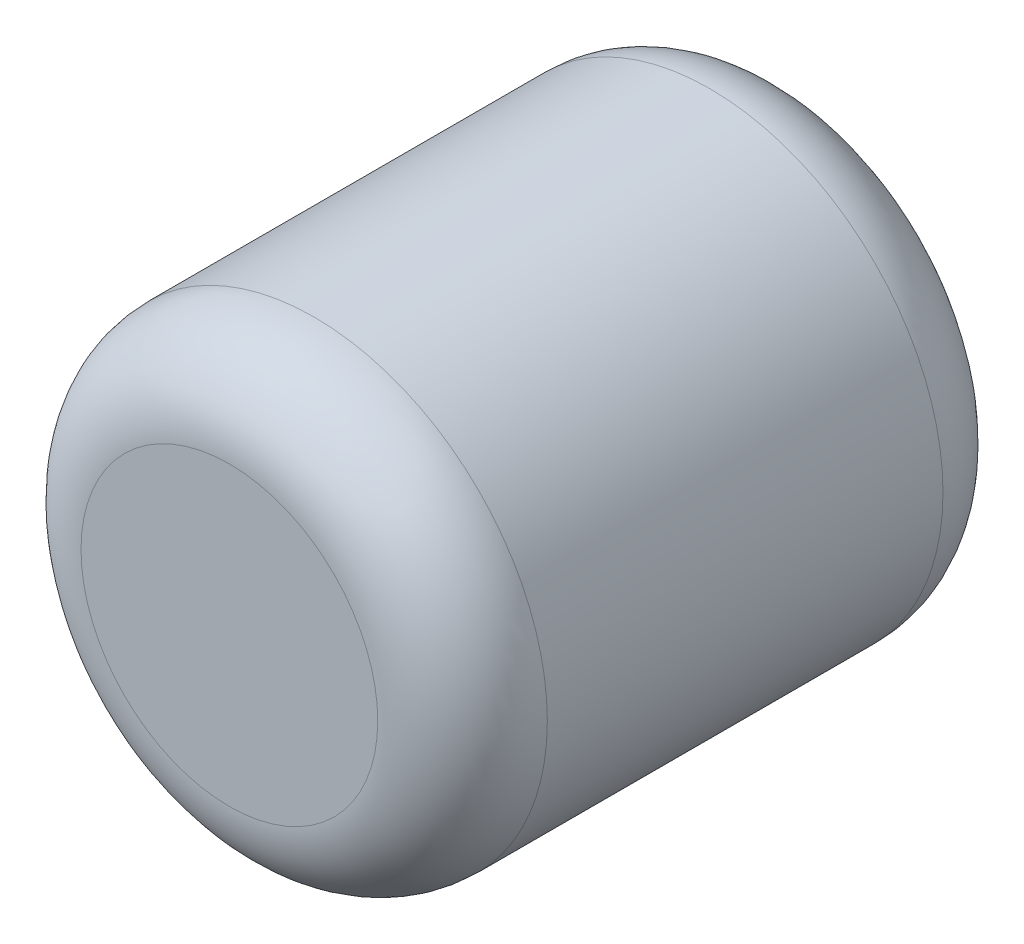
ISO-10303-21;
HEADER;
FILE_DESCRIPTION(('STEP AP214'),'2;1');
FILE_NAME('part.step','',(''),(''),'','','');
FILE_SCHEMA(('AUTOMOTIVE_DESIGN { 1 0 10303 214 1 1 1 1 }'));
ENDSEC;
DATA;
#1=APPLICATION_CONTEXT('core data for automotive mechanical design processes');
#2=APPLICATION_PROTOCOL_DEFINITION('international standard','automotive_design',2000,#1);
#3=PRODUCT_CONTEXT('',#1,'mechanical');
#4=PRODUCT('Part','Part','',(#3));
#5=PRODUCT_RELATED_PRODUCT_CATEGORY('part','',(#4));
#6=PRODUCT_DEFINITION_FORMATION('','',#4);
#7=PRODUCT_DEFINITION_CONTEXT('part definition',#1,'design');
#8=PRODUCT_DEFINITION('design','',#6,#7);
#9=PRODUCT_DEFINITION_SHAPE('','',#8);
#10=(LENGTH_UNIT() NAMED_UNIT(*) SI_UNIT(.MILLI.,.METRE.));
#11=(NAMED_UNIT(*) PLANE_ANGLE_UNIT() SI_UNIT($,.RADIAN.));
#12=(NAMED_UNIT(*) SI_UNIT($,.STERADIAN.) SOLID_ANGLE_UNIT());
#13=UNCERTAINTY_MEASURE_WITH_UNIT(LENGTH_MEASURE(1.E-05),#10,'distance_accuracy_value','');
#14=(GEOMETRIC_REPRESENTATION_CONTEXT(3) GLOBAL_UNCERTAINTY_ASSIGNED_CONTEXT((#13)) GLOBAL_UNIT_ASSIGNED_CONTEXT((#10,
#11,#12)) REPRESENTATION_CONTEXT('',''));
#15=CARTESIAN_POINT('',(0.,0.,0.));
#16=DIRECTION('',(0.,0.,1.));
#17=DIRECTION('',(1.,0.,0.));
#18=AXIS2_PLACEMENT_3D('',#15,#16,#17);
#19=CARTESIAN_POINT('',(0.,0.,20.));
#20=DIRECTION('',(0.,0.,-1.));
#21=DIRECTION('',(-1.,0.,0.));
#22=AXIS2_PLACEMENT_3D('',#19,#20,#21);
#23=CYLINDRICAL_SURFACE('',#22,8.25);
#24=CARTESIAN_POINT('',(0.,0.,17.));
#25=DIRECTION('',(0.,0.,1.));
#26=DIRECTION('',(1.,0.,0.));
#27=AXIS2_PLACEMENT_3D('',#24,#25,#26);
#28=CIRCLE('',#27,8.25);
#29=CARTESIAN_POINT('',(8.25,0.,17.));
#30=VERTEX_POINT('',#29);
#31=EDGE_CURVE('E42',#30,#30,#28,.F.);
#32=ORIENTED_EDGE('',*,*,#31,.T.);
#33=EDGE_LOOP('',(#32));
#34=FACE_BOUND('',#33,.T.);
#35=CARTESIAN_POINT('',(0.,0.,3.));
#36=DIRECTION('',(0.,0.,1.));
#37=DIRECTION('',(1.,0.,0.));
#38=AXIS2_PLACEMENT_3D('',#35,#36,#37);
#39=CIRCLE('',#38,8.25);
#40=CARTESIAN_POINT('',(8.25,0.,3.));
#41=VERTEX_POINT('',#40);
#42=EDGE_CURVE('E46',#41,#41,#39,.T.);
#43=ORIENTED_EDGE('',*,*,#42,.T.);
#44=EDGE_LOOP('',(#43));
#45=FACE_BOUND('',#44,.T.);
#46=ADVANCED_FACE('F35',(#34,#45),#23,.T.);
#47=CARTESIAN_POINT('',(0.,0.,20.));
#48=DIRECTION('',(0.,0.,1.));
#49=DIRECTION('',(1.,0.,0.));
#50=AXIS2_PLACEMENT_3D('',#47,#48,#49);
#51=PLANE('',#50);
#52=CARTESIAN_POINT('',(0.,0.,20.));
#53=DIRECTION('',(0.,0.,1.));
#54=DIRECTION('',(1.,0.,0.));
#55=AXIS2_PLACEMENT_3D('',#52,#53,#54);
#56=CIRCLE('',#55,5.25);
#57=CARTESIAN_POINT('',(5.25,0.,20.));
#58=VERTEX_POINT('',#57);
#59=EDGE_CURVE('E50',#58,#58,#56,.T.);
#60=ORIENTED_EDGE('',*,*,#59,.T.);
#61=EDGE_LOOP('',(#60));
#62=FACE_BOUND('',#61,.T.);
#63=ADVANCED_FACE('F56',(#62),#51,.T.);
#64=CARTESIAN_POINT('',(0.,0.,0.));
#65=DIRECTION('',(0.,0.,1.));
#66=DIRECTION('',(1.,0.,0.));
#67=AXIS2_PLACEMENT_3D('',#64,#65,#66);
#68=PLANE('',#67);
#69=CARTESIAN_POINT('',(0.,0.,0.));
#70=DIRECTION('',(0.,0.,1.));
#71=DIRECTION('',(1.,0.,0.));
#72=AXIS2_PLACEMENT_3D('',#69,#70,#71);
#73=CIRCLE('',#72,5.25);
#74=CARTESIAN_POINT('',(5.25,0.,0.));
#75=VERTEX_POINT('',#74);
#76=EDGE_CURVE('E10',#75,#75,#73,.F.);
#77=ORIENTED_EDGE('',*,*,#76,.T.);
#78=EDGE_LOOP('',(#77));
#79=FACE_BOUND('',#78,.T.);
#80=ADVANCED_FACE('F60',(#79),#68,.F.);
#81=CARTESIAN_POINT('',(0.,0.,17.));
#82=DIRECTION('',(0.,0.,1.));
#83=DIRECTION('',(1.,0.,0.));
#84=AXIS2_PLACEMENT_3D('',#81,#82,#83);
#85=TOROIDAL_SURFACE('',#84,5.25,3.);
#86=ORIENTED_EDGE('',*,*,#31,.F.);
#87=EDGE_LOOP('',(#86));
#88=FACE_BOUND('',#87,.T.);
#89=ORIENTED_EDGE('',*,*,#59,.F.);
#90=EDGE_LOOP('',(#89));
#91=FACE_BOUND('',#90,.T.);
#92=ADVANCED_FACE('F58',(#88,#91),#85,.T.);
#93=CARTESIAN_POINT('',(0.,0.,3.));
#94=DIRECTION('',(0.,0.,1.));
#95=DIRECTION('',(1.,0.,0.));
#96=AXIS2_PLACEMENT_3D('',#93,#94,#95);
#97=TOROIDAL_SURFACE('',#96,5.25,3.);
#98=ORIENTED_EDGE('',*,*,#76,.F.);
#99=EDGE_LOOP('',(#98));
#100=FACE_BOUND('',#99,.T.);
#101=ORIENTED_EDGE('',*,*,#42,.F.);
#102=EDGE_LOOP('',(#101));
#103=FACE_BOUND('',#102,.T.);
#104=ADVANCED_FACE('F37',(#100,#103),#97,.T.);
#105=CLOSED_SHELL('',(#46,#63,#80,#92,#104));
#106=MANIFOLD_SOLID_BREP('B2',#105);
#107=ADVANCED_BREP_SHAPE_REPRESENTATION('',(#18,#106),#14);
#108=SHAPE_DEFINITION_REPRESENTATION(#9,#107);
ENDSEC;
END-ISO-10303-21;
